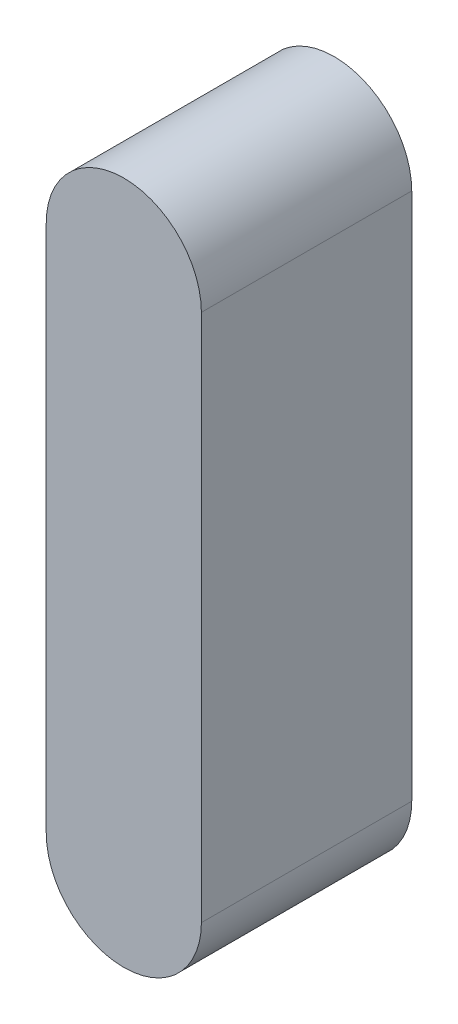
ISO-10303-21;
HEADER;
FILE_DESCRIPTION(('STEP AP214'),'2;1');
FILE_NAME('part.step','',(''),(''),'','','');
FILE_SCHEMA(('AUTOMOTIVE_DESIGN { 1 0 10303 214 1 1 1 1 }'));
ENDSEC;
DATA;
#1=APPLICATION_CONTEXT('core data for automotive mechanical design processes');
#2=APPLICATION_PROTOCOL_DEFINITION('international standard','automotive_design',2000,#1);
#3=PRODUCT_CONTEXT('',#1,'mechanical');
#4=PRODUCT('Part','Part','',(#3));
#5=PRODUCT_RELATED_PRODUCT_CATEGORY('part','',(#4));
#6=PRODUCT_DEFINITION_FORMATION('','',#4);
#7=PRODUCT_DEFINITION_CONTEXT('part definition',#1,'design');
#8=PRODUCT_DEFINITION('design','',#6,#7);
#9=PRODUCT_DEFINITION_SHAPE('','',#8);
#10=(LENGTH_UNIT() NAMED_UNIT(*) SI_UNIT(.MILLI.,.METRE.));
#11=(NAMED_UNIT(*) PLANE_ANGLE_UNIT() SI_UNIT($,.RADIAN.));
#12=(NAMED_UNIT(*) SI_UNIT($,.STERADIAN.) SOLID_ANGLE_UNIT());
#13=UNCERTAINTY_MEASURE_WITH_UNIT(LENGTH_MEASURE(1.E-05),#10,'distance_accuracy_value','');
#14=(GEOMETRIC_REPRESENTATION_CONTEXT(3) GLOBAL_UNCERTAINTY_ASSIGNED_CONTEXT((#13)) GLOBAL_UNIT_ASSIGNED_CONTEXT((#10,
#11,#12)) REPRESENTATION_CONTEXT('',''));
#15=CARTESIAN_POINT('',(0.,0.,0.));
#16=DIRECTION('',(0.,0.,1.));
#17=DIRECTION('',(1.,0.,0.));
#18=AXIS2_PLACEMENT_3D('',#15,#16,#17);
#19=CARTESIAN_POINT('',(1.475,0.,4.));
#20=DIRECTION('',(-1.,0.,0.));
#21=DIRECTION('',(0.,-1.,0.));
#22=AXIS2_PLACEMENT_3D('',#19,#20,#21);
#23=PLANE('',#22);
#24=DIRECTION('',(0.,1.,0.));
#25=VECTOR('',#24,1.);
#26=CARTESIAN_POINT('',(1.475,0.,0.));
#27=LINE('',#26,#25);
#28=CARTESIAN_POINT('',(1.475,-5.025,0.));
#29=VERTEX_POINT('',#28);
#30=CARTESIAN_POINT('',(1.475,5.025,0.));
#31=VERTEX_POINT('',#30);
#32=EDGE_CURVE('E112',#29,#31,#27,.T.);
#33=ORIENTED_EDGE('',*,*,#32,.T.);
#34=DIRECTION('',(0.,0.,-1.));
#35=VECTOR('',#34,1.);
#36=CARTESIAN_POINT('',(1.475,5.025,4.));
#37=LINE('',#36,#35);
#38=CARTESIAN_POINT('',(1.475,5.025,4.));
#39=VERTEX_POINT('',#38);
#40=EDGE_CURVE('E11',#39,#31,#37,.T.);
#41=ORIENTED_EDGE('',*,*,#40,.F.);
#42=DIRECTION('',(0.,1.,0.));
#43=VECTOR('',#42,1.);
#44=CARTESIAN_POINT('',(1.475,0.,4.));
#45=LINE('',#44,#43);
#46=CARTESIAN_POINT('',(1.475,-5.025,4.));
#47=VERTEX_POINT('',#46);
#48=EDGE_CURVE('E93',#47,#39,#45,.T.);
#49=ORIENTED_EDGE('',*,*,#48,.F.);
#50=DIRECTION('',(0.,0.,-1.));
#51=VECTOR('',#50,1.);
#52=CARTESIAN_POINT('',(1.475,-5.025,4.));
#53=LINE('',#52,#51);
#54=EDGE_CURVE('E108',#47,#29,#53,.T.);
#55=ORIENTED_EDGE('',*,*,#54,.T.);
#56=EDGE_LOOP('',(#33,#41,#49,#55));
#57=FACE_BOUND('',#56,.T.);
#58=ADVANCED_FACE('F45',(#57),#23,.F.);
#59=CARTESIAN_POINT('',(0.,5.025,4.));
#60=DIRECTION('',(0.,0.,-1.));
#61=DIRECTION('',(-1.,0.,0.));
#62=AXIS2_PLACEMENT_3D('',#59,#60,#61);
#63=CYLINDRICAL_SURFACE('',#62,1.475);
#64=CARTESIAN_POINT('',(0.,5.025,0.));
#65=DIRECTION('',(0.,0.,1.));
#66=DIRECTION('',(1.,0.,0.));
#67=AXIS2_PLACEMENT_3D('',#64,#65,#66);
#68=CIRCLE('',#67,1.475);
#69=CARTESIAN_POINT('',(-1.475,5.025,0.));
#70=VERTEX_POINT('',#69);
#71=EDGE_CURVE('E99',#31,#70,#68,.T.);
#72=ORIENTED_EDGE('',*,*,#71,.T.);
#73=DIRECTION('',(0.,0.,-1.));
#74=VECTOR('',#73,1.);
#75=CARTESIAN_POINT('',(-1.475,5.025,4.));
#76=LINE('',#75,#74);
#77=CARTESIAN_POINT('',(-1.475,5.025,4.));
#78=VERTEX_POINT('',#77);
#79=EDGE_CURVE('E54',#78,#70,#76,.T.);
#80=ORIENTED_EDGE('',*,*,#79,.F.);
#81=CARTESIAN_POINT('',(0.,5.025,4.));
#82=DIRECTION('',(0.,0.,1.));
#83=DIRECTION('',(1.,0.,0.));
#84=AXIS2_PLACEMENT_3D('',#81,#82,#83);
#85=CIRCLE('',#84,1.475);
#86=EDGE_CURVE('E88',#39,#78,#85,.T.);
#87=ORIENTED_EDGE('',*,*,#86,.F.);
#88=ORIENTED_EDGE('',*,*,#40,.T.);
#89=EDGE_LOOP('',(#72,#80,#87,#88));
#90=FACE_BOUND('',#89,.T.);
#91=ADVANCED_FACE('F98',(#90),#63,.T.);
#92=CARTESIAN_POINT('',(-1.475,0.,4.));
#93=DIRECTION('',(-1.,0.,0.));
#94=DIRECTION('',(0.,-1.,0.));
#95=AXIS2_PLACEMENT_3D('',#92,#93,#94);
#96=PLANE('',#95);
#97=DIRECTION('',(0.,1.,0.));
#98=VECTOR('',#97,1.);
#99=CARTESIAN_POINT('',(-1.475,0.,0.));
#100=LINE('',#99,#98);
#101=CARTESIAN_POINT('',(-1.475,-5.025,0.));
#102=VERTEX_POINT('',#101);
#103=EDGE_CURVE('E118',#102,#70,#100,.T.);
#104=ORIENTED_EDGE('',*,*,#103,.F.);
#105=DIRECTION('',(0.,0.,-1.));
#106=VECTOR('',#105,1.);
#107=CARTESIAN_POINT('',(-1.475,-5.025,4.));
#108=LINE('',#107,#106);
#109=CARTESIAN_POINT('',(-1.475,-5.025,4.));
#110=VERTEX_POINT('',#109);
#111=EDGE_CURVE('E78',#110,#102,#108,.T.);
#112=ORIENTED_EDGE('',*,*,#111,.F.);
#113=DIRECTION('',(0.,1.,0.));
#114=VECTOR('',#113,1.);
#115=CARTESIAN_POINT('',(-1.475,0.,4.));
#116=LINE('',#115,#114);
#117=EDGE_CURVE('E91',#110,#78,#116,.T.);
#118=ORIENTED_EDGE('',*,*,#117,.T.);
#119=ORIENTED_EDGE('',*,*,#79,.T.);
#120=EDGE_LOOP('',(#104,#112,#118,#119));
#121=FACE_BOUND('',#120,.T.);
#122=ADVANCED_FACE('F104',(#121),#96,.T.);
#123=CARTESIAN_POINT('',(0.,-5.025,4.));
#124=DIRECTION('',(0.,0.,-1.));
#125=DIRECTION('',(-1.,0.,0.));
#126=AXIS2_PLACEMENT_3D('',#123,#124,#125);
#127=CYLINDRICAL_SURFACE('',#126,1.475);
#128=CARTESIAN_POINT('',(0.,-5.025,0.));
#129=DIRECTION('',(0.,0.,1.));
#130=DIRECTION('',(1.,0.,0.));
#131=AXIS2_PLACEMENT_3D('',#128,#129,#130);
#132=CIRCLE('',#131,1.475);
#133=EDGE_CURVE('E81',#102,#29,#132,.T.);
#134=ORIENTED_EDGE('',*,*,#133,.T.);
#135=ORIENTED_EDGE('',*,*,#54,.F.);
#136=CARTESIAN_POINT('',(0.,-5.025,4.));
#137=DIRECTION('',(0.,0.,1.));
#138=DIRECTION('',(1.,0.,0.));
#139=AXIS2_PLACEMENT_3D('',#136,#137,#138);
#140=CIRCLE('',#139,1.475);
#141=EDGE_CURVE('E62',#110,#47,#140,.T.);
#142=ORIENTED_EDGE('',*,*,#141,.F.);
#143=ORIENTED_EDGE('',*,*,#111,.T.);
#144=EDGE_LOOP('',(#134,#135,#142,#143));
#145=FACE_BOUND('',#144,.T.);
#146=ADVANCED_FACE('F135',(#145),#127,.T.);
#147=CARTESIAN_POINT('',(0.,0.,4.));
#148=DIRECTION('',(0.,0.,1.));
#149=DIRECTION('',(1.,0.,0.));
#150=AXIS2_PLACEMENT_3D('',#147,#148,#149);
#151=PLANE('',#150);
#152=ORIENTED_EDGE('',*,*,#48,.T.);
#153=ORIENTED_EDGE('',*,*,#86,.T.);
#154=ORIENTED_EDGE('',*,*,#117,.F.);
#155=ORIENTED_EDGE('',*,*,#141,.T.);
#156=EDGE_LOOP('',(#152,#153,#154,#155));
#157=FACE_BOUND('',#156,.T.);
#158=ADVANCED_FACE('F89',(#157),#151,.T.);
#159=CARTESIAN_POINT('',(0.,0.,0.));
#160=DIRECTION('',(0.,0.,1.));
#161=DIRECTION('',(1.,0.,0.));
#162=AXIS2_PLACEMENT_3D('',#159,#160,#161);
#163=PLANE('',#162);
#164=ORIENTED_EDGE('',*,*,#32,.F.);
#165=ORIENTED_EDGE('',*,*,#133,.F.);
#166=ORIENTED_EDGE('',*,*,#103,.T.);
#167=ORIENTED_EDGE('',*,*,#71,.F.);
#168=EDGE_LOOP('',(#164,#165,#166,#167));
#169=FACE_BOUND('',#168,.T.);
#170=ADVANCED_FACE('F129',(#169),#163,.F.);
#171=CLOSED_SHELL('',(#58,#91,#122,#146,#158,#170));
#172=MANIFOLD_SOLID_BREP('B2',#171);
#173=ADVANCED_BREP_SHAPE_REPRESENTATION('',(#18,#172),#14);
#174=SHAPE_DEFINITION_REPRESENTATION(#9,#173);
ENDSEC;
END-ISO-10303-21;
